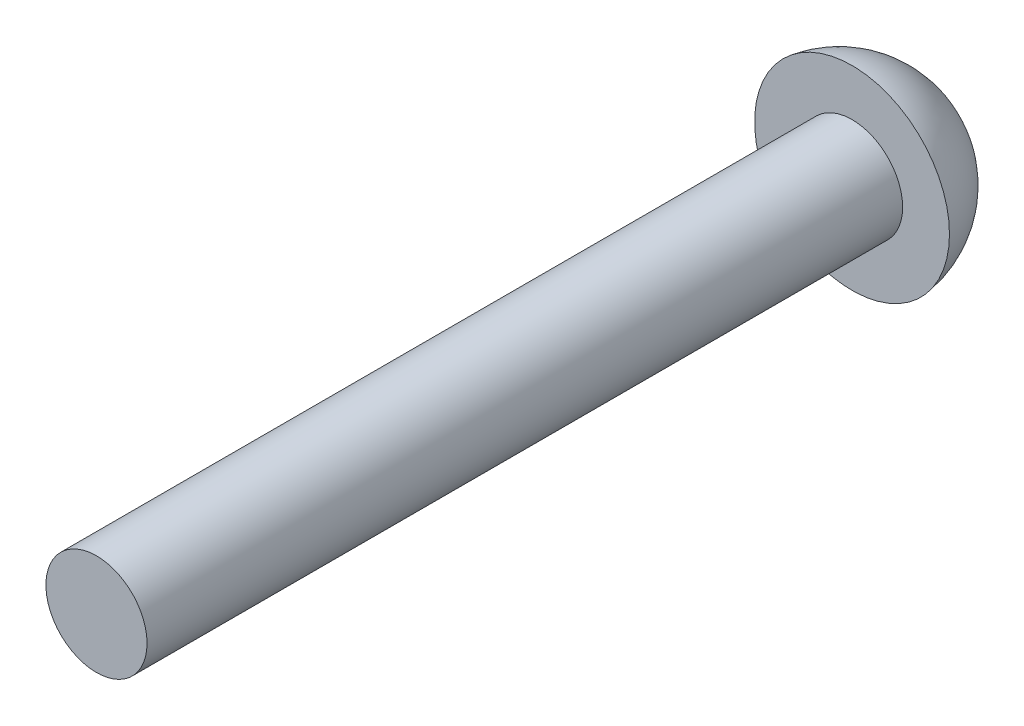
ISO-10303-21;
HEADER;
FILE_DESCRIPTION(('STEP AP214'),'2;1');
FILE_NAME('part.step','',(''),(''),'','','');
FILE_SCHEMA(('AUTOMOTIVE_DESIGN { 1 0 10303 214 1 1 1 1 }'));
ENDSEC;
DATA;
#1=APPLICATION_CONTEXT('core data for automotive mechanical design processes');
#2=APPLICATION_PROTOCOL_DEFINITION('international standard','automotive_design',2000,#1);
#3=PRODUCT_CONTEXT('',#1,'mechanical');
#4=PRODUCT('Part','Part','',(#3));
#5=PRODUCT_RELATED_PRODUCT_CATEGORY('part','',(#4));
#6=PRODUCT_DEFINITION_FORMATION('','',#4);
#7=PRODUCT_DEFINITION_CONTEXT('part definition',#1,'design');
#8=PRODUCT_DEFINITION('design','',#6,#7);
#9=PRODUCT_DEFINITION_SHAPE('','',#8);
#10=(LENGTH_UNIT() NAMED_UNIT(*) SI_UNIT(.MILLI.,.METRE.));
#11=(NAMED_UNIT(*) PLANE_ANGLE_UNIT() SI_UNIT($,.RADIAN.));
#12=(NAMED_UNIT(*) SI_UNIT($,.STERADIAN.) SOLID_ANGLE_UNIT());
#13=UNCERTAINTY_MEASURE_WITH_UNIT(LENGTH_MEASURE(1.E-05),#10,'distance_accuracy_value','');
#14=(GEOMETRIC_REPRESENTATION_CONTEXT(3) GLOBAL_UNCERTAINTY_ASSIGNED_CONTEXT((#13)) GLOBAL_UNIT_ASSIGNED_CONTEXT((#10,
#11,#12)) REPRESENTATION_CONTEXT('',''));
#15=CARTESIAN_POINT('',(0.,0.,0.));
#16=DIRECTION('',(0.,0.,1.));
#17=DIRECTION('',(1.,0.,0.));
#18=AXIS2_PLACEMENT_3D('',#15,#16,#17);
#19=CARTESIAN_POINT('',(0.,0.,0.));
#20=DIRECTION('',(0.,0.,1.));
#21=DIRECTION('',(1.,0.,0.));
#22=AXIS2_PLACEMENT_3D('',#19,#20,#21);
#23=PLANE('',#22);
#24=CARTESIAN_POINT('',(0.,0.,0.));
#25=DIRECTION('',(0.,0.,1.));
#26=DIRECTION('',(1.,0.,0.));
#27=AXIS2_PLACEMENT_3D('',#24,#25,#26);
#28=CIRCLE('',#27,1.7);
#29=CARTESIAN_POINT('',(1.7,0.,0.));
#30=VERTEX_POINT('',#29);
#31=EDGE_CURVE('E10',#30,#30,#28,.T.);
#32=ORIENTED_EDGE('',*,*,#31,.T.);
#33=EDGE_LOOP('',(#32));
#34=FACE_BOUND('',#33,.T.);
#35=ADVANCED_FACE('F31',(#34),#23,.T.);
#36=CARTESIAN_POINT('',(0.,0.,0.));
#37=DIRECTION('',(0.,0.,1.));
#38=DIRECTION('',(1.,0.,0.));
#39=AXIS2_PLACEMENT_3D('',#36,#37,#38);
#40=CYLINDRICAL_SURFACE('',#39,1.7);
#41=CARTESIAN_POINT('',(0.,0.,-25.4));
#42=DIRECTION('',(0.,0.,1.));
#43=DIRECTION('',(1.,0.,0.));
#44=AXIS2_PLACEMENT_3D('',#41,#42,#43);
#45=CIRCLE('',#44,1.7);
#46=CARTESIAN_POINT('',(1.7,0.,-25.4));
#47=VERTEX_POINT('',#46);
#48=EDGE_CURVE('E37',#47,#47,#45,.T.);
#49=ORIENTED_EDGE('',*,*,#48,.T.);
#50=EDGE_LOOP('',(#49));
#51=FACE_BOUND('',#50,.T.);
#52=ORIENTED_EDGE('',*,*,#31,.F.);
#53=EDGE_LOOP('',(#52));
#54=FACE_BOUND('',#53,.T.);
#55=ADVANCED_FACE('F57',(#51,#54),#40,.T.);
#56=CARTESIAN_POINT('',(1.7,0.,-25.4));
#57=DIRECTION('',(0.,0.,1.));
#58=DIRECTION('',(1.,0.,0.));
#59=AXIS2_PLACEMENT_3D('',#56,#57,#58);
#60=PLANE('',#59);
#61=CARTESIAN_POINT('',(0.,0.,-25.4));
#62=DIRECTION('',(0.,0.,1.));
#63=DIRECTION('',(1.,0.,0.));
#64=AXIS2_PLACEMENT_3D('',#61,#62,#63);
#65=CIRCLE('',#64,3.275);
#66=CARTESIAN_POINT('',(3.275,0.,-25.4));
#67=VERTEX_POINT('',#66);
#68=EDGE_CURVE('E41',#67,#67,#65,.T.);
#69=ORIENTED_EDGE('',*,*,#68,.T.);
#70=EDGE_LOOP('',(#69));
#71=FACE_BOUND('',#70,.T.);
#72=ORIENTED_EDGE('',*,*,#48,.F.);
#73=EDGE_LOOP('',(#72));
#74=FACE_BOUND('',#73,.T.);
#75=ADVANCED_FACE('F48',(#71,#74),#60,.T.);
#76=CARTESIAN_POINT('',(0.,0.,-24.9664242160279));
#77=DIRECTION('',(0.,0.,1.));
#78=DIRECTION('',(1.,0.,0.));
#79=AXIS2_PLACEMENT_3D('',#76,#77,#78);
#80=SPHERICAL_SURFACE('',#79,3.30357578397212);
#81=ORIENTED_EDGE('',*,*,#68,.F.);
#82=EDGE_LOOP('',(#81));
#83=FACE_BOUND('',#82,.T.);
#84=ADVANCED_FACE('F51',(#83),#80,.T.);
#85=CLOSED_SHELL('',(#35,#55,#75,#84));
#86=MANIFOLD_SOLID_BREP('B2',#85);
#87=ADVANCED_BREP_SHAPE_REPRESENTATION('',(#18,#86),#14);
#88=SHAPE_DEFINITION_REPRESENTATION(#9,#87);
ENDSEC;
END-ISO-10303-21;
